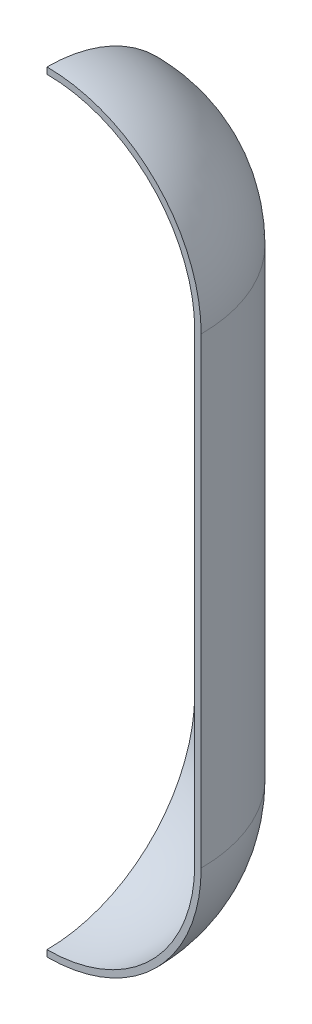
ISO-10303-21;
HEADER;
FILE_DESCRIPTION(('STEP AP214'),'2;1');
FILE_NAME('part.step','',(''),(''),'','','');
FILE_SCHEMA(('AUTOMOTIVE_DESIGN { 1 0 10303 214 1 1 1 1 }'));
ENDSEC;
DATA;
#1=APPLICATION_CONTEXT('core data for automotive mechanical design processes');
#2=APPLICATION_PROTOCOL_DEFINITION('international standard','automotive_design',2000,#1);
#3=PRODUCT_CONTEXT('',#1,'mechanical');
#4=PRODUCT('Part','Part','',(#3));
#5=PRODUCT_RELATED_PRODUCT_CATEGORY('part','',(#4));
#6=PRODUCT_DEFINITION_FORMATION('','',#4);
#7=PRODUCT_DEFINITION_CONTEXT('part definition',#1,'design');
#8=PRODUCT_DEFINITION('design','',#6,#7);
#9=PRODUCT_DEFINITION_SHAPE('','',#8);
#10=(LENGTH_UNIT() NAMED_UNIT(*) SI_UNIT(.MILLI.,.METRE.));
#11=(NAMED_UNIT(*) PLANE_ANGLE_UNIT() SI_UNIT($,.RADIAN.));
#12=(NAMED_UNIT(*) SI_UNIT($,.STERADIAN.) SOLID_ANGLE_UNIT());
#13=UNCERTAINTY_MEASURE_WITH_UNIT(LENGTH_MEASURE(1.E-05),#10,'distance_accuracy_value','');
#14=(GEOMETRIC_REPRESENTATION_CONTEXT(3) GLOBAL_UNCERTAINTY_ASSIGNED_CONTEXT((#13)) GLOBAL_UNIT_ASSIGNED_CONTEXT((#10,
#11,#12)) REPRESENTATION_CONTEXT('',''));
#15=CARTESIAN_POINT('',(0.,0.,0.));
#16=DIRECTION('',(0.,0.,1.));
#17=DIRECTION('',(1.,0.,0.));
#18=AXIS2_PLACEMENT_3D('',#15,#16,#17);
#19=CARTESIAN_POINT('',(0.,914.4,-1.11022302462516E-13));
#20=DIRECTION('',(0.,-1.,0.));
#21=DIRECTION('',(0.,0.,-1.));
#22=AXIS2_PLACEMENT_3D('',#19,#20,#21);
#23=SPHERICAL_SURFACE('',#22,304.8);
#24=CARTESIAN_POINT('',(1.11022302462516E-13,914.4,0.));
#25=DIRECTION('',(0.,0.,1.));
#26=DIRECTION('',(1.,0.,0.));
#27=AXIS2_PLACEMENT_3D('',#24,#25,#26);
#28=CIRCLE('',#27,304.8);
#29=CARTESIAN_POINT('',(304.8,914.4,0.));
#30=VERTEX_POINT('',#29);
#31=CARTESIAN_POINT('',(0.,1219.2,6.76975836499949E-13));
#32=VERTEX_POINT('',#31);
#33=EDGE_CURVE('E108',#30,#32,#28,.T.);
#34=ORIENTED_EDGE('',*,*,#33,.F.);
#35=CARTESIAN_POINT('',(0.,914.4,0.));
#36=DIRECTION('',(0.,-1.,0.));
#37=DIRECTION('',(0.,0.,-1.));
#38=AXIS2_PLACEMENT_3D('',#35,#36,#37);
#39=CIRCLE('',#38,304.8);
#40=CARTESIAN_POINT('',(-1.06420351207939E-12,914.4,-304.8));
#41=VERTEX_POINT('',#40);
#42=EDGE_CURVE('E53',#41,#30,#39,.T.);
#43=ORIENTED_EDGE('',*,*,#42,.F.);
#44=CARTESIAN_POINT('',(0.,914.4,-1.11022302462516E-13));
#45=DIRECTION('',(1.,0.,0.));
#46=DIRECTION('',(0.,0.,-1.));
#47=AXIS2_PLACEMENT_3D('',#44,#45,#46);
#48=CIRCLE('',#47,304.8);
#49=EDGE_CURVE('E122',#41,#32,#48,.T.);
#50=ORIENTED_EDGE('',*,*,#49,.T.);
#51=EDGE_LOOP('',(#34,#43,#50));
#52=FACE_BOUND('',#51,.T.);
#53=ADVANCED_FACE('F38',(#52),#23,.T.);
#54=CARTESIAN_POINT('',(0.,914.4,-1.11022302462516E-13));
#55=DIRECTION('',(0.,-1.,0.));
#56=DIRECTION('',(0.,0.,1.));
#57=AXIS2_PLACEMENT_3D('',#54,#55,#56);
#58=SPHERICAL_SURFACE('',#57,292.1);
#59=CARTESIAN_POINT('',(0.,914.4,0.));
#60=DIRECTION('',(0.,-1.,0.));
#61=DIRECTION('',(0.,0.,-1.));
#62=AXIS2_PLACEMENT_3D('',#59,#60,#61);
#63=CIRCLE('',#62,292.1);
#64=CARTESIAN_POINT('',(-1.01986169907608E-12,914.4,-292.1));
#65=VERTEX_POINT('',#64);
#66=CARTESIAN_POINT('',(292.1,914.4,0.));
#67=VERTEX_POINT('',#66);
#68=EDGE_CURVE('E11',#65,#67,#63,.T.);
#69=ORIENTED_EDGE('',*,*,#68,.T.);
#70=CARTESIAN_POINT('',(1.11022302462516E-13,914.4,0.));
#71=DIRECTION('',(0.,0.,-1.));
#72=DIRECTION('',(1.,0.,0.));
#73=AXIS2_PLACEMENT_3D('',#70,#71,#72);
#74=CIRCLE('',#73,292.1);
#75=CARTESIAN_POINT('',(0.,1206.5,6.49402480219157E-13));
#76=VERTEX_POINT('',#75);
#77=EDGE_CURVE('E92',#76,#67,#74,.T.);
#78=ORIENTED_EDGE('',*,*,#77,.F.);
#79=CARTESIAN_POINT('',(0.,914.4,-1.11022302462516E-13));
#80=DIRECTION('',(-1.,0.,0.));
#81=DIRECTION('',(0.,0.,-1.));
#82=AXIS2_PLACEMENT_3D('',#79,#80,#81);
#83=CIRCLE('',#82,292.1);
#84=EDGE_CURVE('E95',#76,#65,#83,.T.);
#85=ORIENTED_EDGE('',*,*,#84,.T.);
#86=EDGE_LOOP('',(#69,#78,#85));
#87=FACE_BOUND('',#86,.T.);
#88=ADVANCED_FACE('F40',(#87),#58,.F.);
#89=CARTESIAN_POINT('',(0.,1258.63414444279,0.));
#90=DIRECTION('',(0.,-1.,0.));
#91=DIRECTION('',(0.,0.,-1.));
#92=AXIS2_PLACEMENT_3D('',#89,#90,#91);
#93=CYLINDRICAL_SURFACE('',#92,292.1);
#94=CARTESIAN_POINT('',(0.,0.,0.));
#95=DIRECTION('',(0.,-1.,0.));
#96=DIRECTION('',(0.,0.,-1.));
#97=AXIS2_PLACEMENT_3D('',#94,#95,#96);
#98=CIRCLE('',#97,292.1);
#99=CARTESIAN_POINT('',(-1.01986169907608E-12,0.,-292.1));
#100=VERTEX_POINT('',#99);
#101=CARTESIAN_POINT('',(292.1,0.,0.));
#102=VERTEX_POINT('',#101);
#103=EDGE_CURVE('E46',#100,#102,#98,.T.);
#104=ORIENTED_EDGE('',*,*,#103,.T.);
#105=DIRECTION('',(0.,-1.,0.));
#106=VECTOR('',#105,1.);
#107=CARTESIAN_POINT('',(292.1,0.,0.));
#108=LINE('',#107,#106);
#109=EDGE_CURVE('E105',#67,#102,#108,.T.);
#110=ORIENTED_EDGE('',*,*,#109,.F.);
#111=ORIENTED_EDGE('',*,*,#68,.F.);
#112=DIRECTION('',(0.,-1.,0.));
#113=VECTOR('',#112,1.);
#114=CARTESIAN_POINT('',(-1.01986169907608E-12,0.,-292.1));
#115=LINE('',#114,#113);
#116=EDGE_CURVE('E126',#65,#100,#115,.T.);
#117=ORIENTED_EDGE('',*,*,#116,.T.);
#118=EDGE_LOOP('',(#104,#110,#111,#117));
#119=FACE_BOUND('',#118,.T.);
#120=ADVANCED_FACE('F110',(#119),#93,.F.);
#121=CARTESIAN_POINT('',(0.,0.,-1.66533453693773E-13));
#122=DIRECTION('',(0.,-1.,0.));
#123=DIRECTION('',(0.,0.,-1.));
#124=AXIS2_PLACEMENT_3D('',#121,#122,#123);
#125=SPHERICAL_SURFACE('',#124,292.1);
#126=CARTESIAN_POINT('',(1.66533453693773E-13,0.,0.));
#127=DIRECTION('',(0.,0.,-1.));
#128=DIRECTION('',(-1.,0.,0.));
#129=AXIS2_PLACEMENT_3D('',#126,#127,#128);
#130=CIRCLE('',#129,292.1);
#131=CARTESIAN_POINT('',(0.,-292.1,8.62411775022845E-13));
#132=VERTEX_POINT('',#131);
#133=EDGE_CURVE('E111',#102,#132,#130,.T.);
#134=ORIENTED_EDGE('',*,*,#133,.F.);
#135=ORIENTED_EDGE('',*,*,#103,.F.);
#136=CARTESIAN_POINT('',(0.,0.,-1.66533453693773E-13));
#137=DIRECTION('',(-1.,0.,0.));
#138=DIRECTION('',(0.,0.,1.));
#139=AXIS2_PLACEMENT_3D('',#136,#137,#138);
#140=CIRCLE('',#139,292.1);
#141=EDGE_CURVE('E128',#100,#132,#140,.T.);
#142=ORIENTED_EDGE('',*,*,#141,.T.);
#143=EDGE_LOOP('',(#134,#135,#142));
#144=FACE_BOUND('',#143,.T.);
#145=ADVANCED_FACE('F148',(#144),#125,.F.);
#146=CARTESIAN_POINT('',(0.,0.,-1.66533453693773E-13));
#147=DIRECTION('',(0.,-1.,0.));
#148=DIRECTION('',(0.,0.,1.));
#149=AXIS2_PLACEMENT_3D('',#146,#147,#148);
#150=SPHERICAL_SURFACE('',#149,304.8);
#151=CARTESIAN_POINT('',(0.,0.,0.));
#152=DIRECTION('',(0.,-1.,0.));
#153=DIRECTION('',(0.,0.,-1.));
#154=AXIS2_PLACEMENT_3D('',#151,#152,#153);
#155=CIRCLE('',#154,304.8);
#156=CARTESIAN_POINT('',(-1.06420351207939E-12,0.,-304.8));
#157=VERTEX_POINT('',#156);
#158=CARTESIAN_POINT('',(304.8,0.,0.));
#159=VERTEX_POINT('',#158);
#160=EDGE_CURVE('E61',#157,#159,#155,.T.);
#161=ORIENTED_EDGE('',*,*,#160,.T.);
#162=CARTESIAN_POINT('',(1.66533453693773E-13,0.,0.));
#163=DIRECTION('',(0.,0.,1.));
#164=DIRECTION('',(-1.,0.,0.));
#165=AXIS2_PLACEMENT_3D('',#162,#163,#164);
#166=CIRCLE('',#165,304.8);
#167=CARTESIAN_POINT('',(0.,-304.8,8.60342823947602E-13));
#168=VERTEX_POINT('',#167);
#169=EDGE_CURVE('E113',#168,#159,#166,.T.);
#170=ORIENTED_EDGE('',*,*,#169,.F.);
#171=CARTESIAN_POINT('',(0.,0.,-1.66533453693773E-13));
#172=DIRECTION('',(1.,0.,0.));
#173=DIRECTION('',(0.,0.,1.));
#174=AXIS2_PLACEMENT_3D('',#171,#172,#173);
#175=CIRCLE('',#174,304.8);
#176=EDGE_CURVE('E134',#168,#157,#175,.T.);
#177=ORIENTED_EDGE('',*,*,#176,.T.);
#178=EDGE_LOOP('',(#161,#170,#177));
#179=FACE_BOUND('',#178,.T.);
#180=ADVANCED_FACE('F140',(#179),#150,.T.);
#181=CARTESIAN_POINT('',(0.,1258.63414444279,0.));
#182=DIRECTION('',(0.,-1.,0.));
#183=DIRECTION('',(0.,0.,-1.));
#184=AXIS2_PLACEMENT_3D('',#181,#182,#183);
#185=CYLINDRICAL_SURFACE('',#184,304.8);
#186=DIRECTION('',(0.,1.,0.));
#187=VECTOR('',#186,1.);
#188=CARTESIAN_POINT('',(-1.06420351207939E-12,0.,-304.8));
#189=LINE('',#188,#187);
#190=EDGE_CURVE('E136',#157,#41,#189,.T.);
#191=ORIENTED_EDGE('',*,*,#190,.T.);
#192=ORIENTED_EDGE('',*,*,#42,.T.);
#193=DIRECTION('',(0.,1.,0.));
#194=VECTOR('',#193,1.);
#195=CARTESIAN_POINT('',(304.8,0.,0.));
#196=LINE('',#195,#194);
#197=EDGE_CURVE('E119',#159,#30,#196,.T.);
#198=ORIENTED_EDGE('',*,*,#197,.F.);
#199=ORIENTED_EDGE('',*,*,#160,.F.);
#200=EDGE_LOOP('',(#191,#192,#198,#199));
#201=FACE_BOUND('',#200,.T.);
#202=ADVANCED_FACE('F143',(#201),#185,.T.);
#203=CARTESIAN_POINT('',(0.,914.4,-1.11022302462516E-13));
#204=DIRECTION('',(1.,0.,0.));
#205=DIRECTION('',(0.,0.,-1.));
#206=AXIS2_PLACEMENT_3D('',#203,#204,#205);
#207=PLANE('',#206);
#208=ORIENTED_EDGE('',*,*,#49,.F.);
#209=ORIENTED_EDGE('',*,*,#190,.F.);
#210=ORIENTED_EDGE('',*,*,#176,.F.);
#211=DIRECTION('',(0.,-1.,0.));
#212=VECTOR('',#211,1.);
#213=CARTESIAN_POINT('',(0.,-292.1,8.62411775022845E-13));
#214=LINE('',#213,#212);
#215=EDGE_CURVE('E131',#132,#168,#214,.T.);
#216=ORIENTED_EDGE('',*,*,#215,.F.);
#217=ORIENTED_EDGE('',*,*,#141,.F.);
#218=ORIENTED_EDGE('',*,*,#116,.F.);
#219=ORIENTED_EDGE('',*,*,#84,.F.);
#220=DIRECTION('',(0.,-1.,0.));
#221=VECTOR('',#220,1.);
#222=CARTESIAN_POINT('',(0.,1219.2,6.76975836499949E-13));
#223=LINE('',#222,#221);
#224=EDGE_CURVE('E107',#32,#76,#223,.T.);
#225=ORIENTED_EDGE('',*,*,#224,.F.);
#226=EDGE_LOOP('',(#208,#209,#210,#216,#217,#218,#219,#225));
#227=FACE_BOUND('',#226,.T.);
#228=ADVANCED_FACE('F145',(#227),#207,.F.);
#229=CARTESIAN_POINT('',(1.11022302462516E-13,914.4,0.));
#230=DIRECTION('',(0.,0.,1.));
#231=DIRECTION('',(1.,0.,0.));
#232=AXIS2_PLACEMENT_3D('',#229,#230,#231);
#233=PLANE('',#232);
#234=ORIENTED_EDGE('',*,*,#33,.T.);
#235=ORIENTED_EDGE('',*,*,#224,.T.);
#236=ORIENTED_EDGE('',*,*,#77,.T.);
#237=ORIENTED_EDGE('',*,*,#109,.T.);
#238=ORIENTED_EDGE('',*,*,#133,.T.);
#239=ORIENTED_EDGE('',*,*,#215,.T.);
#240=ORIENTED_EDGE('',*,*,#169,.T.);
#241=ORIENTED_EDGE('',*,*,#197,.T.);
#242=EDGE_LOOP('',(#234,#235,#236,#237,#238,#239,#240,#241));
#243=FACE_BOUND('',#242,.T.);
#244=ADVANCED_FACE('F103',(#243),#233,.T.);
#245=CLOSED_SHELL('',(#53,#88,#120,#145,#180,#202,#228,#244));
#246=MANIFOLD_SOLID_BREP('B2',#245);
#247=ADVANCED_BREP_SHAPE_REPRESENTATION('',(#18,#246),#14);
#248=SHAPE_DEFINITION_REPRESENTATION(#9,#247);
ENDSEC;
END-ISO-10303-21;
